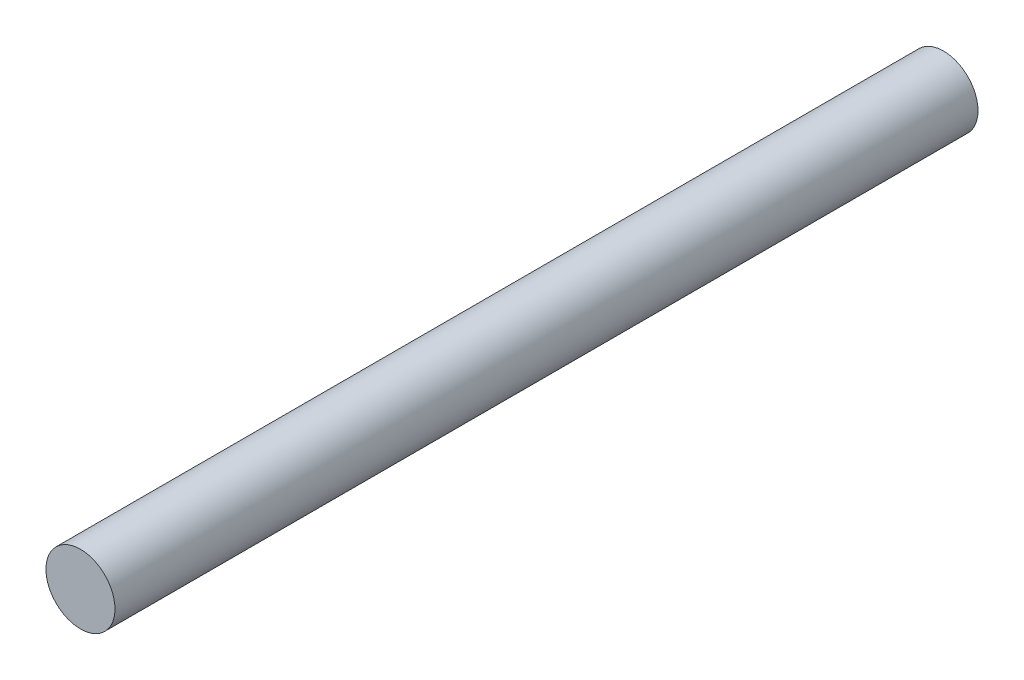
ISO-10303-21;
HEADER;
FILE_DESCRIPTION(('STEP AP214'),'2;1');
FILE_NAME('part.step','',(''),(''),'','','');
FILE_SCHEMA(('AUTOMOTIVE_DESIGN { 1 0 10303 214 1 1 1 1 }'));
ENDSEC;
DATA;
#1=APPLICATION_CONTEXT('core data for automotive mechanical design processes');
#2=APPLICATION_PROTOCOL_DEFINITION('international standard','automotive_design',2000,#1);
#3=PRODUCT_CONTEXT('',#1,'mechanical');
#4=PRODUCT('Part','Part','',(#3));
#5=PRODUCT_RELATED_PRODUCT_CATEGORY('part','',(#4));
#6=PRODUCT_DEFINITION_FORMATION('','',#4);
#7=PRODUCT_DEFINITION_CONTEXT('part definition',#1,'design');
#8=PRODUCT_DEFINITION('design','',#6,#7);
#9=PRODUCT_DEFINITION_SHAPE('','',#8);
#10=(LENGTH_UNIT() NAMED_UNIT(*) SI_UNIT(.MILLI.,.METRE.));
#11=(NAMED_UNIT(*) PLANE_ANGLE_UNIT() SI_UNIT($,.RADIAN.));
#12=(NAMED_UNIT(*) SI_UNIT($,.STERADIAN.) SOLID_ANGLE_UNIT());
#13=UNCERTAINTY_MEASURE_WITH_UNIT(LENGTH_MEASURE(1.E-05),#10,'distance_accuracy_value','');
#14=(GEOMETRIC_REPRESENTATION_CONTEXT(3) GLOBAL_UNCERTAINTY_ASSIGNED_CONTEXT((#13)) GLOBAL_UNIT_ASSIGNED_CONTEXT((#10,
#11,#12)) REPRESENTATION_CONTEXT('',''));
#15=CARTESIAN_POINT('',(0.,0.,0.));
#16=DIRECTION('',(0.,0.,1.));
#17=DIRECTION('',(1.,0.,0.));
#18=AXIS2_PLACEMENT_3D('',#15,#16,#17);
#19=CARTESIAN_POINT('',(0.,0.,500.));
#20=DIRECTION('',(0.,0.,-1.));
#21=DIRECTION('',(-1.,0.,0.));
#22=AXIS2_PLACEMENT_3D('',#19,#20,#21);
#23=CYLINDRICAL_SURFACE('',#22,20.);
#24=CARTESIAN_POINT('',(0.,0.,500.));
#25=DIRECTION('',(0.,0.,1.));
#26=DIRECTION('',(1.,0.,0.));
#27=AXIS2_PLACEMENT_3D('',#24,#25,#26);
#28=CIRCLE('',#27,20.);
#29=CARTESIAN_POINT('',(20.,0.,500.));
#30=VERTEX_POINT('',#29);
#31=EDGE_CURVE('E10',#30,#30,#28,.T.);
#32=ORIENTED_EDGE('',*,*,#31,.F.);
#33=EDGE_LOOP('',(#32));
#34=FACE_BOUND('',#33,.T.);
#35=CARTESIAN_POINT('',(0.,0.,0.));
#36=DIRECTION('',(0.,0.,1.));
#37=DIRECTION('',(1.,0.,0.));
#38=AXIS2_PLACEMENT_3D('',#35,#36,#37);
#39=CIRCLE('',#38,20.);
#40=CARTESIAN_POINT('',(20.,0.,0.));
#41=VERTEX_POINT('',#40);
#42=EDGE_CURVE('E34',#41,#41,#39,.T.);
#43=ORIENTED_EDGE('',*,*,#42,.T.);
#44=EDGE_LOOP('',(#43));
#45=FACE_BOUND('',#44,.T.);
#46=ADVANCED_FACE('F31',(#34,#45),#23,.T.);
#47=CARTESIAN_POINT('',(0.,0.,500.));
#48=DIRECTION('',(0.,0.,1.));
#49=DIRECTION('',(1.,0.,0.));
#50=AXIS2_PLACEMENT_3D('',#47,#48,#49);
#51=PLANE('',#50);
#52=ORIENTED_EDGE('',*,*,#31,.T.);
#53=EDGE_LOOP('',(#52));
#54=FACE_BOUND('',#53,.T.);
#55=ADVANCED_FACE('F46',(#54),#51,.T.);
#56=CARTESIAN_POINT('',(0.,0.,0.));
#57=DIRECTION('',(0.,0.,1.));
#58=DIRECTION('',(1.,0.,0.));
#59=AXIS2_PLACEMENT_3D('',#56,#57,#58);
#60=PLANE('',#59);
#61=ORIENTED_EDGE('',*,*,#42,.F.);
#62=EDGE_LOOP('',(#61));
#63=FACE_BOUND('',#62,.T.);
#64=ADVANCED_FACE('F44',(#63),#60,.F.);
#65=CLOSED_SHELL('',(#46,#55,#64));
#66=MANIFOLD_SOLID_BREP('B2',#65);
#67=ADVANCED_BREP_SHAPE_REPRESENTATION('',(#18,#66),#14);
#68=SHAPE_DEFINITION_REPRESENTATION(#9,#67);
ENDSEC;
END-ISO-10303-21;
